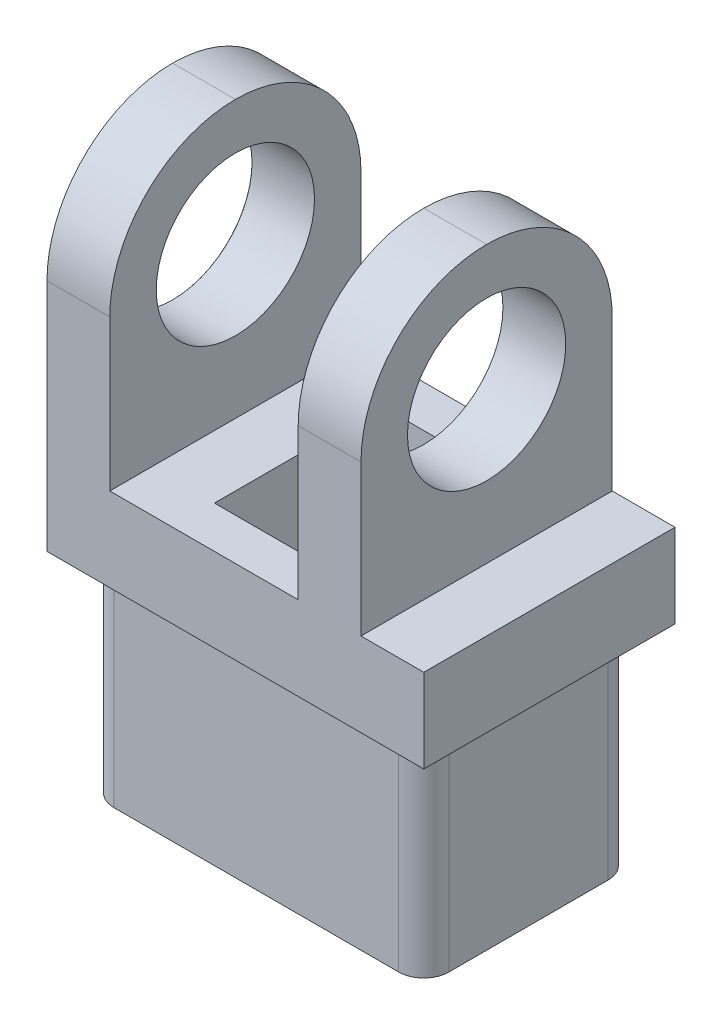
ISO-10303-21;
HEADER;
FILE_DESCRIPTION(('STEP AP214'),'2;1');
FILE_NAME('part.step','',(''),(''),'','','');
FILE_SCHEMA(('AUTOMOTIVE_DESIGN { 1 0 10303 214 1 1 1 1 }'));
ENDSEC;
DATA;
#1=APPLICATION_CONTEXT('core data for automotive mechanical design processes');
#2=APPLICATION_PROTOCOL_DEFINITION('international standard','automotive_design',2000,#1);
#3=PRODUCT_CONTEXT('',#1,'mechanical');
#4=PRODUCT('Part','Part','',(#3));
#5=PRODUCT_RELATED_PRODUCT_CATEGORY('part','',(#4));
#6=PRODUCT_DEFINITION_FORMATION('','',#4);
#7=PRODUCT_DEFINITION_CONTEXT('part definition',#1,'design');
#8=PRODUCT_DEFINITION('design','',#6,#7);
#9=PRODUCT_DEFINITION_SHAPE('','',#8);
#10=(LENGTH_UNIT() NAMED_UNIT(*) SI_UNIT(.MILLI.,.METRE.));
#11=(NAMED_UNIT(*) PLANE_ANGLE_UNIT() SI_UNIT($,.RADIAN.));
#12=(NAMED_UNIT(*) SI_UNIT($,.STERADIAN.) SOLID_ANGLE_UNIT());
#13=UNCERTAINTY_MEASURE_WITH_UNIT(LENGTH_MEASURE(1.E-05),#10,'distance_accuracy_value','');
#14=(GEOMETRIC_REPRESENTATION_CONTEXT(3) GLOBAL_UNCERTAINTY_ASSIGNED_CONTEXT((#13)) GLOBAL_UNIT_ASSIGNED_CONTEXT((#10,
#11,#12)) REPRESENTATION_CONTEXT('',''));
#15=CARTESIAN_POINT('',(0.,0.,0.));
#16=DIRECTION('',(0.,0.,1.));
#17=DIRECTION('',(1.,0.,0.));
#18=AXIS2_PLACEMENT_3D('',#15,#16,#17);
#19=CARTESIAN_POINT('',(0.,0.,0.));
#20=DIRECTION('',(0.,1.,0.));
#21=DIRECTION('',(0.,0.,1.));
#22=AXIS2_PLACEMENT_3D('',#19,#20,#21);
#23=PLANE('',#22);
#24=DIRECTION('',(-1.,0.,0.));
#25=VECTOR('',#24,1.);
#26=CARTESIAN_POINT('',(9.525,0.,-15.875));
#27=LINE('',#26,#25);
#28=CARTESIAN_POINT('',(19.05,0.,-15.875));
#29=VERTEX_POINT('',#28);
#30=CARTESIAN_POINT('',(9.525,0.,-15.875));
#31=VERTEX_POINT('',#30);
#32=EDGE_CURVE('E214',#29,#31,#27,.T.);
#33=ORIENTED_EDGE('',*,*,#32,.F.);
#34=DIRECTION('',(0.,0.,-1.));
#35=VECTOR('',#34,1.);
#36=CARTESIAN_POINT('',(19.05,0.,0.));
#37=LINE('',#36,#35);
#38=CARTESIAN_POINT('',(19.05,0.,-19.05));
#39=VERTEX_POINT('',#38);
#40=EDGE_CURVE('E310',#29,#39,#37,.T.);
#41=ORIENTED_EDGE('',*,*,#40,.T.);
#42=DIRECTION('',(1.,0.,0.));
#43=VECTOR('',#42,1.);
#44=CARTESIAN_POINT('',(0.,0.,-19.05));
#45=LINE('',#44,#43);
#46=CARTESIAN_POINT('',(4.7625,0.,-19.05));
#47=VERTEX_POINT('',#46);
#48=EDGE_CURVE('E257',#47,#39,#45,.T.);
#49=ORIENTED_EDGE('',*,*,#48,.F.);
#50=DIRECTION('',(0.,0.,1.));
#51=VECTOR('',#50,1.);
#52=CARTESIAN_POINT('',(4.7625,0.,0.));
#53=LINE('',#52,#51);
#54=CARTESIAN_POINT('',(4.7625,0.,0.));
#55=VERTEX_POINT('',#54);
#56=EDGE_CURVE('E299',#47,#55,#53,.T.);
#57=ORIENTED_EDGE('',*,*,#56,.T.);
#58=DIRECTION('',(1.,0.,0.));
#59=VECTOR('',#58,1.);
#60=CARTESIAN_POINT('',(0.,0.,0.));
#61=LINE('',#60,#59);
#62=CARTESIAN_POINT('',(19.05,0.,0.));
#63=VERTEX_POINT('',#62);
#64=EDGE_CURVE('E261',#55,#63,#61,.T.);
#65=ORIENTED_EDGE('',*,*,#64,.T.);
#66=CARTESIAN_POINT('',(19.05,0.,-3.175));
#67=VERTEX_POINT('',#66);
#68=EDGE_CURVE('E311',#63,#67,#37,.T.);
#69=ORIENTED_EDGE('',*,*,#68,.T.);
#70=DIRECTION('',(1.,0.,0.));
#71=VECTOR('',#70,1.);
#72=CARTESIAN_POINT('',(9.525,0.,-3.175));
#73=LINE('',#72,#71);
#74=CARTESIAN_POINT('',(9.525,0.,-3.175));
#75=VERTEX_POINT('',#74);
#76=EDGE_CURVE('E50',#75,#67,#73,.T.);
#77=ORIENTED_EDGE('',*,*,#76,.F.);
#78=DIRECTION('',(0.,0.,1.));
#79=VECTOR('',#78,1.);
#80=CARTESIAN_POINT('',(9.525,0.,-15.875));
#81=LINE('',#80,#79);
#82=EDGE_CURVE('E202',#31,#75,#81,.T.);
#83=ORIENTED_EDGE('',*,*,#82,.F.);
#84=EDGE_LOOP('',(#33,#41,#49,#57,#65,#69,#77,#83));
#85=FACE_BOUND('',#84,.T.);
#86=ADVANCED_FACE('F35',(#85),#23,.T.);
#87=CARTESIAN_POINT('',(4.7625,20.955,0.));
#88=DIRECTION('',(1.,0.,0.));
#89=DIRECTION('',(0.,0.,-1.));
#90=AXIS2_PLACEMENT_3D('',#87,#88,#89);
#91=PLANE('',#90);
#92=CARTESIAN_POINT('',(4.7625,11.43,-9.525));
#93=DIRECTION('',(1.,0.,0.));
#94=DIRECTION('',(0.,0.,-1.));
#95=AXIS2_PLACEMENT_3D('',#92,#93,#94);
#96=CIRCLE('',#95,5.99999999999999);
#97=CARTESIAN_POINT('',(4.7625,11.43,-15.525));
#98=VERTEX_POINT('',#97);
#99=EDGE_CURVE('E238',#98,#98,#96,.T.);
#100=ORIENTED_EDGE('',*,*,#99,.F.);
#101=EDGE_LOOP('',(#100));
#102=FACE_BOUND('',#101,.T.);
#103=DIRECTION('',(0.,-1.,0.));
#104=VECTOR('',#103,1.);
#105=CARTESIAN_POINT('',(4.7625,20.955,-19.05));
#106=LINE('',#105,#104);
#107=CARTESIAN_POINT('',(4.7625,11.43,-19.05));
#108=VERTEX_POINT('',#107);
#109=EDGE_CURVE('E308',#108,#47,#106,.T.);
#110=ORIENTED_EDGE('',*,*,#109,.F.);
#111=CARTESIAN_POINT('',(4.7625,11.43,-9.525));
#112=DIRECTION('',(1.,0.,0.));
#113=DIRECTION('',(0.,0.,-1.));
#114=AXIS2_PLACEMENT_3D('',#111,#112,#113);
#115=CIRCLE('',#114,9.525);
#116=CARTESIAN_POINT('',(4.7625,20.955,-9.525));
#117=VERTEX_POINT('',#116);
#118=EDGE_CURVE('E327',#108,#117,#115,.T.);
#119=ORIENTED_EDGE('',*,*,#118,.T.);
#120=CARTESIAN_POINT('',(4.7625,11.43,-9.525));
#121=DIRECTION('',(1.,0.,0.));
#122=DIRECTION('',(0.,0.,-1.));
#123=AXIS2_PLACEMENT_3D('',#120,#121,#122);
#124=CIRCLE('',#123,9.525);
#125=CARTESIAN_POINT('',(4.7625,11.43,0.));
#126=VERTEX_POINT('',#125);
#127=EDGE_CURVE('E325',#117,#126,#124,.T.);
#128=ORIENTED_EDGE('',*,*,#127,.T.);
#129=DIRECTION('',(0.,-1.,0.));
#130=VECTOR('',#129,1.);
#131=CARTESIAN_POINT('',(4.7625,20.955,0.));
#132=LINE('',#131,#130);
#133=EDGE_CURVE('E302',#126,#55,#132,.T.);
#134=ORIENTED_EDGE('',*,*,#133,.T.);
#135=ORIENTED_EDGE('',*,*,#56,.F.);
#136=EDGE_LOOP('',(#110,#119,#128,#134,#135));
#137=FACE_BOUND('',#136,.T.);
#138=ADVANCED_FACE('F429',(#102,#137),#91,.T.);
#139=CARTESIAN_POINT('',(0.,20.955,-19.05));
#140=DIRECTION('',(0.,0.,-1.));
#141=DIRECTION('',(-1.,0.,0.));
#142=AXIS2_PLACEMENT_3D('',#139,#140,#141);
#143=PLANE('',#142);
#144=DIRECTION('',(0.,-1.,0.));
#145=VECTOR('',#144,1.);
#146=CARTESIAN_POINT('',(0.,20.955,-19.05));
#147=LINE('',#146,#145);
#148=CARTESIAN_POINT('',(0.,11.43,-19.05));
#149=VERTEX_POINT('',#148);
#150=CARTESIAN_POINT('',(0.,-6.35,-19.05));
#151=VERTEX_POINT('',#150);
#152=EDGE_CURVE('E306',#149,#151,#147,.T.);
#153=ORIENTED_EDGE('',*,*,#152,.F.);
#154=DIRECTION('',(1.,0.,0.));
#155=VECTOR('',#154,1.);
#156=CARTESIAN_POINT('',(0.,11.43,-19.05));
#157=LINE('',#156,#155);
#158=EDGE_CURVE('E322',#149,#108,#157,.T.);
#159=ORIENTED_EDGE('',*,*,#158,.T.);
#160=ORIENTED_EDGE('',*,*,#109,.T.);
#161=ORIENTED_EDGE('',*,*,#48,.T.);
#162=DIRECTION('',(0.,-1.,0.));
#163=VECTOR('',#162,1.);
#164=CARTESIAN_POINT('',(19.05,20.955,-19.05));
#165=LINE('',#164,#163);
#166=CARTESIAN_POINT('',(19.05,11.43,-19.05));
#167=VERTEX_POINT('',#166);
#168=EDGE_CURVE('E282',#167,#39,#165,.T.);
#169=ORIENTED_EDGE('',*,*,#168,.F.);
#170=DIRECTION('',(1.,0.,0.));
#171=VECTOR('',#170,1.);
#172=CARTESIAN_POINT('',(0.,11.43,-19.05));
#173=LINE('',#172,#171);
#174=CARTESIAN_POINT('',(23.8125,11.43,-19.05));
#175=VERTEX_POINT('',#174);
#176=EDGE_CURVE('E320',#167,#175,#173,.T.);
#177=ORIENTED_EDGE('',*,*,#176,.T.);
#178=DIRECTION('',(0.,-1.,0.));
#179=VECTOR('',#178,1.);
#180=CARTESIAN_POINT('',(23.8125,20.955,-19.05));
#181=LINE('',#180,#179);
#182=CARTESIAN_POINT('',(23.8125,0.,-19.05));
#183=VERTEX_POINT('',#182);
#184=EDGE_CURVE('E285',#175,#183,#181,.T.);
#185=ORIENTED_EDGE('',*,*,#184,.T.);
#186=CARTESIAN_POINT('',(28.575,0.,-19.05));
#187=VERTEX_POINT('',#186);
#188=EDGE_CURVE('E255',#183,#187,#45,.T.);
#189=ORIENTED_EDGE('',*,*,#188,.T.);
#190=DIRECTION('',(0.,1.,0.));
#191=VECTOR('',#190,1.);
#192=CARTESIAN_POINT('',(28.575,-6.35,-19.05));
#193=LINE('',#192,#191);
#194=CARTESIAN_POINT('',(28.575,-6.35,-19.05));
#195=VERTEX_POINT('',#194);
#196=EDGE_CURVE('E264',#195,#187,#193,.T.);
#197=ORIENTED_EDGE('',*,*,#196,.F.);
#198=DIRECTION('',(1.,0.,0.));
#199=VECTOR('',#198,1.);
#200=CARTESIAN_POINT('',(0.,-6.35,-19.05));
#201=LINE('',#200,#199);
#202=EDGE_CURVE('E242',#151,#195,#201,.T.);
#203=ORIENTED_EDGE('',*,*,#202,.F.);
#204=EDGE_LOOP('',(#153,#159,#160,#161,#169,#177,#185,#189,#197,#203));
#205=FACE_BOUND('',#204,.T.);
#206=ADVANCED_FACE('F436',(#205),#143,.T.);
#207=CARTESIAN_POINT('',(0.,20.955,0.));
#208=DIRECTION('',(-1.,0.,0.));
#209=DIRECTION('',(0.,0.,1.));
#210=AXIS2_PLACEMENT_3D('',#207,#208,#209);
#211=PLANE('',#210);
#212=CARTESIAN_POINT('',(0.,11.43,-9.525));
#213=DIRECTION('',(-1.,0.,0.));
#214=DIRECTION('',(0.,0.,1.));
#215=AXIS2_PLACEMENT_3D('',#212,#213,#214);
#216=CIRCLE('',#215,6.025);
#217=CARTESIAN_POINT('',(0.,11.43,-3.5));
#218=VERTEX_POINT('',#217);
#219=EDGE_CURVE('E225',#218,#218,#216,.T.);
#220=ORIENTED_EDGE('',*,*,#219,.F.);
#221=EDGE_LOOP('',(#220));
#222=FACE_BOUND('',#221,.T.);
#223=CARTESIAN_POINT('',(0.,11.43,-9.525));
#224=DIRECTION('',(-1.,0.,0.));
#225=DIRECTION('',(0.,0.,1.));
#226=AXIS2_PLACEMENT_3D('',#223,#224,#225);
#227=CIRCLE('',#226,9.525);
#228=CARTESIAN_POINT('',(0.,11.43,0.));
#229=VERTEX_POINT('',#228);
#230=CARTESIAN_POINT('',(0.,20.955,-9.525));
#231=VERTEX_POINT('',#230);
#232=EDGE_CURVE('E329',#229,#231,#227,.T.);
#233=ORIENTED_EDGE('',*,*,#232,.T.);
#234=CARTESIAN_POINT('',(0.,11.43,-9.525));
#235=DIRECTION('',(-1.,0.,0.));
#236=DIRECTION('',(0.,0.,1.));
#237=AXIS2_PLACEMENT_3D('',#234,#235,#236);
#238=CIRCLE('',#237,9.525);
#239=EDGE_CURVE('E331',#231,#149,#238,.T.);
#240=ORIENTED_EDGE('',*,*,#239,.T.);
#241=ORIENTED_EDGE('',*,*,#152,.T.);
#242=DIRECTION('',(0.,0.,-1.));
#243=VECTOR('',#242,1.);
#244=CARTESIAN_POINT('',(0.,-6.35,0.));
#245=LINE('',#244,#243);
#246=CARTESIAN_POINT('',(0.,-6.35,0.));
#247=VERTEX_POINT('',#246);
#248=EDGE_CURVE('E244',#247,#151,#245,.T.);
#249=ORIENTED_EDGE('',*,*,#248,.F.);
#250=DIRECTION('',(0.,-1.,0.));
#251=VECTOR('',#250,1.);
#252=CARTESIAN_POINT('',(0.,20.955,0.));
#253=LINE('',#252,#251);
#254=EDGE_CURVE('E304',#229,#247,#253,.T.);
#255=ORIENTED_EDGE('',*,*,#254,.F.);
#256=EDGE_LOOP('',(#233,#240,#241,#249,#255));
#257=FACE_BOUND('',#256,.T.);
#258=ADVANCED_FACE('F453',(#222,#257),#211,.T.);
#259=CARTESIAN_POINT('',(0.,20.955,0.));
#260=DIRECTION('',(0.,0.,-1.));
#261=DIRECTION('',(-1.,0.,0.));
#262=AXIS2_PLACEMENT_3D('',#259,#260,#261);
#263=PLANE('',#262);
#264=ORIENTED_EDGE('',*,*,#133,.F.);
#265=DIRECTION('',(1.,0.,0.));
#266=VECTOR('',#265,1.);
#267=CARTESIAN_POINT('',(0.,11.43,0.));
#268=LINE('',#267,#266);
#269=EDGE_CURVE('E336',#126,#229,#268,.F.);
#270=ORIENTED_EDGE('',*,*,#269,.T.);
#271=ORIENTED_EDGE('',*,*,#254,.T.);
#272=DIRECTION('',(1.,0.,0.));
#273=VECTOR('',#272,1.);
#274=CARTESIAN_POINT('',(0.,-6.35,0.));
#275=LINE('',#274,#273);
#276=CARTESIAN_POINT('',(28.575,-6.35,0.));
#277=VERTEX_POINT('',#276);
#278=EDGE_CURVE('E248',#247,#277,#275,.T.);
#279=ORIENTED_EDGE('',*,*,#278,.T.);
#280=DIRECTION('',(0.,1.,0.));
#281=VECTOR('',#280,1.);
#282=CARTESIAN_POINT('',(28.575,-6.35,0.));
#283=LINE('',#282,#281);
#284=CARTESIAN_POINT('',(28.575,0.,0.));
#285=VERTEX_POINT('',#284);
#286=EDGE_CURVE('E254',#277,#285,#283,.T.);
#287=ORIENTED_EDGE('',*,*,#286,.T.);
#288=CARTESIAN_POINT('',(23.8125,0.,0.));
#289=VERTEX_POINT('',#288);
#290=EDGE_CURVE('E259',#289,#285,#61,.T.);
#291=ORIENTED_EDGE('',*,*,#290,.F.);
#292=DIRECTION('',(0.,-1.,0.));
#293=VECTOR('',#292,1.);
#294=CARTESIAN_POINT('',(23.8125,20.955,0.));
#295=LINE('',#294,#293);
#296=CARTESIAN_POINT('',(23.8125,11.43,0.));
#297=VERTEX_POINT('',#296);
#298=EDGE_CURVE('E278',#297,#289,#295,.T.);
#299=ORIENTED_EDGE('',*,*,#298,.F.);
#300=DIRECTION('',(1.,0.,0.));
#301=VECTOR('',#300,1.);
#302=CARTESIAN_POINT('',(19.05,11.43,0.));
#303=LINE('',#302,#301);
#304=CARTESIAN_POINT('',(19.05,11.43,0.));
#305=VERTEX_POINT('',#304);
#306=EDGE_CURVE('E333',#297,#305,#303,.F.);
#307=ORIENTED_EDGE('',*,*,#306,.T.);
#308=DIRECTION('',(0.,-1.,0.));
#309=VECTOR('',#308,1.);
#310=CARTESIAN_POINT('',(19.05,20.955,0.));
#311=LINE('',#310,#309);
#312=EDGE_CURVE('E280',#305,#63,#311,.T.);
#313=ORIENTED_EDGE('',*,*,#312,.T.);
#314=ORIENTED_EDGE('',*,*,#64,.F.);
#315=EDGE_LOOP('',(#264,#270,#271,#279,#287,#291,#299,#307,#313,#314));
#316=FACE_BOUND('',#315,.T.);
#317=ADVANCED_FACE('F444',(#316),#263,.F.);
#318=ORIENTED_EDGE('',*,*,#188,.F.);
#319=DIRECTION('',(0.,0.,-1.));
#320=VECTOR('',#319,1.);
#321=CARTESIAN_POINT('',(23.8125,0.,0.));
#322=LINE('',#321,#320);
#323=EDGE_CURVE('E314',#289,#183,#322,.T.);
#324=ORIENTED_EDGE('',*,*,#323,.F.);
#325=ORIENTED_EDGE('',*,*,#290,.T.);
#326=DIRECTION('',(0.,0.,-1.));
#327=VECTOR('',#326,1.);
#328=CARTESIAN_POINT('',(28.575,0.,0.));
#329=LINE('',#328,#327);
#330=EDGE_CURVE('E245',#285,#187,#329,.T.);
#331=ORIENTED_EDGE('',*,*,#330,.T.);
#332=EDGE_LOOP('',(#318,#324,#325,#331));
#333=FACE_BOUND('',#332,.T.);
#334=ADVANCED_FACE('F432',(#333),#23,.T.);
#335=CARTESIAN_POINT('',(23.8125,20.955,0.));
#336=DIRECTION('',(1.,0.,0.));
#337=DIRECTION('',(0.,0.,-1.));
#338=AXIS2_PLACEMENT_3D('',#335,#336,#337);
#339=PLANE('',#338);
#340=CARTESIAN_POINT('',(23.8125,11.43,-9.525));
#341=DIRECTION('',(1.,0.,0.));
#342=DIRECTION('',(0.,0.,-1.));
#343=AXIS2_PLACEMENT_3D('',#340,#341,#342);
#344=CIRCLE('',#343,5.99999999999999);
#345=CARTESIAN_POINT('',(23.8125,11.43,-15.525));
#346=VERTEX_POINT('',#345);
#347=EDGE_CURVE('E234',#346,#346,#344,.T.);
#348=ORIENTED_EDGE('',*,*,#347,.F.);
#349=EDGE_LOOP('',(#348));
#350=FACE_BOUND('',#349,.T.);
#351=CARTESIAN_POINT('',(23.8125,11.43,-9.525));
#352=DIRECTION('',(1.,0.,0.));
#353=DIRECTION('',(0.,0.,-1.));
#354=AXIS2_PLACEMENT_3D('',#351,#352,#353);
#355=CIRCLE('',#354,9.525);
#356=CARTESIAN_POINT('',(23.8125,20.955,-9.525));
#357=VERTEX_POINT('',#356);
#358=EDGE_CURVE('E338',#175,#357,#355,.T.);
#359=ORIENTED_EDGE('',*,*,#358,.T.);
#360=CARTESIAN_POINT('',(23.8125,11.43,-9.525));
#361=DIRECTION('',(1.,0.,0.));
#362=DIRECTION('',(0.,0.,-1.));
#363=AXIS2_PLACEMENT_3D('',#360,#361,#362);
#364=CIRCLE('',#363,9.525);
#365=EDGE_CURVE('E340',#357,#297,#364,.T.);
#366=ORIENTED_EDGE('',*,*,#365,.T.);
#367=ORIENTED_EDGE('',*,*,#298,.T.);
#368=ORIENTED_EDGE('',*,*,#323,.T.);
#369=ORIENTED_EDGE('',*,*,#184,.F.);
#370=EDGE_LOOP('',(#359,#366,#367,#368,#369));
#371=FACE_BOUND('',#370,.T.);
#372=ADVANCED_FACE('F443',(#350,#371),#339,.T.);
#373=CARTESIAN_POINT('',(19.05,20.955,0.));
#374=DIRECTION('',(1.,0.,0.));
#375=DIRECTION('',(0.,0.,-1.));
#376=AXIS2_PLACEMENT_3D('',#373,#374,#375);
#377=PLANE('',#376);
#378=CARTESIAN_POINT('',(19.05,11.43,-9.525));
#379=DIRECTION('',(1.,0.,0.));
#380=DIRECTION('',(0.,0.,-1.));
#381=AXIS2_PLACEMENT_3D('',#378,#379,#380);
#382=CIRCLE('',#381,5.99999999999999);
#383=CARTESIAN_POINT('',(19.05,11.43,-15.525));
#384=VERTEX_POINT('',#383);
#385=EDGE_CURVE('E235',#384,#384,#382,.T.);
#386=ORIENTED_EDGE('',*,*,#385,.T.);
#387=EDGE_LOOP('',(#386));
#388=FACE_BOUND('',#387,.T.);
#389=ORIENTED_EDGE('',*,*,#312,.F.);
#390=CARTESIAN_POINT('',(19.05,11.43,-9.525));
#391=DIRECTION('',(1.,0.,0.));
#392=DIRECTION('',(0.,0.,-1.));
#393=AXIS2_PLACEMENT_3D('',#390,#391,#392);
#394=CIRCLE('',#393,9.525);
#395=CARTESIAN_POINT('',(19.05,20.955,-9.525));
#396=VERTEX_POINT('',#395);
#397=EDGE_CURVE('E344',#305,#396,#394,.F.);
#398=ORIENTED_EDGE('',*,*,#397,.T.);
#399=CARTESIAN_POINT('',(19.05,11.43,-9.525));
#400=DIRECTION('',(1.,0.,0.));
#401=DIRECTION('',(0.,0.,-1.));
#402=AXIS2_PLACEMENT_3D('',#399,#400,#401);
#403=CIRCLE('',#402,9.525);
#404=EDGE_CURVE('E342',#396,#167,#403,.F.);
#405=ORIENTED_EDGE('',*,*,#404,.T.);
#406=ORIENTED_EDGE('',*,*,#168,.T.);
#407=ORIENTED_EDGE('',*,*,#40,.F.);
#408=DIRECTION('',(0.,1.,0.));
#409=VECTOR('',#408,1.);
#410=CARTESIAN_POINT('',(19.05,-22.225,-15.875));
#411=LINE('',#410,#409);
#412=CARTESIAN_POINT('',(19.05,-22.225,-15.875));
#413=VERTEX_POINT('',#412);
#414=EDGE_CURVE('E226',#413,#29,#411,.T.);
#415=ORIENTED_EDGE('',*,*,#414,.F.);
#416=DIRECTION('',(0.,0.,-1.));
#417=VECTOR('',#416,1.);
#418=CARTESIAN_POINT('',(19.05,-22.225,-15.875));
#419=LINE('',#418,#417);
#420=CARTESIAN_POINT('',(19.05,-22.225,-3.175));
#421=VERTEX_POINT('',#420);
#422=EDGE_CURVE('E57',#421,#413,#419,.T.);
#423=ORIENTED_EDGE('',*,*,#422,.F.);
#424=DIRECTION('',(0.,1.,0.));
#425=VECTOR('',#424,1.);
#426=CARTESIAN_POINT('',(19.05,-22.225,-3.175));
#427=LINE('',#426,#425);
#428=EDGE_CURVE('E203',#421,#67,#427,.T.);
#429=ORIENTED_EDGE('',*,*,#428,.T.);
#430=ORIENTED_EDGE('',*,*,#68,.F.);
#431=EDGE_LOOP('',(#389,#398,#405,#406,#407,#415,#423,#429,#430));
#432=FACE_BOUND('',#431,.T.);
#433=ADVANCED_FACE('F450',(#388,#432),#377,.F.);
#434=CARTESIAN_POINT('',(28.575,-6.35,0.));
#435=DIRECTION('',(1.,0.,0.));
#436=DIRECTION('',(0.,0.,-1.));
#437=AXIS2_PLACEMENT_3D('',#434,#435,#436);
#438=PLANE('',#437);
#439=ORIENTED_EDGE('',*,*,#330,.F.);
#440=ORIENTED_EDGE('',*,*,#286,.F.);
#441=DIRECTION('',(0.,0.,-1.));
#442=VECTOR('',#441,1.);
#443=CARTESIAN_POINT('',(28.575,-6.35,0.));
#444=LINE('',#443,#442);
#445=EDGE_CURVE('E251',#277,#195,#444,.T.);
#446=ORIENTED_EDGE('',*,*,#445,.T.);
#447=ORIENTED_EDGE('',*,*,#196,.T.);
#448=EDGE_LOOP('',(#439,#440,#446,#447));
#449=FACE_BOUND('',#448,.T.);
#450=ADVANCED_FACE('F466',(#449),#438,.T.);
#451=CARTESIAN_POINT('',(0.,-6.35,0.));
#452=DIRECTION('',(0.,1.,0.));
#453=DIRECTION('',(0.,0.,1.));
#454=AXIS2_PLACEMENT_3D('',#451,#452,#453);
#455=PLANE('',#454);
#456=DIRECTION('',(0.,0.,-1.));
#457=VECTOR('',#456,1.);
#458=CARTESIAN_POINT('',(1.5875,-6.35,-17.4625));
#459=LINE('',#458,#457);
#460=CARTESIAN_POINT('',(1.5875,-6.35,-3.4925));
#461=VERTEX_POINT('',#460);
#462=CARTESIAN_POINT('',(1.5875,-6.35,-15.5575));
#463=VERTEX_POINT('',#462);
#464=EDGE_CURVE('E275',#461,#463,#459,.T.);
#465=ORIENTED_EDGE('',*,*,#464,.F.);
#466=CARTESIAN_POINT('',(3.4925,-6.35,-3.4925));
#467=DIRECTION('',(0.,1.,0.));
#468=DIRECTION('',(0.,0.,1.));
#469=AXIS2_PLACEMENT_3D('',#466,#467,#468);
#470=CIRCLE('',#469,1.905);
#471=CARTESIAN_POINT('',(3.4925,-6.35,-1.5875));
#472=VERTEX_POINT('',#471);
#473=EDGE_CURVE('E382',#461,#472,#470,.T.);
#474=ORIENTED_EDGE('',*,*,#473,.T.);
#475=DIRECTION('',(-1.,0.,0.));
#476=VECTOR('',#475,1.);
#477=CARTESIAN_POINT('',(1.5875,-6.35,-1.5875));
#478=LINE('',#477,#476);
#479=CARTESIAN_POINT('',(25.0825,-6.35,-1.5875));
#480=VERTEX_POINT('',#479);
#481=EDGE_CURVE('E317',#480,#472,#478,.T.);
#482=ORIENTED_EDGE('',*,*,#481,.F.);
#483=CARTESIAN_POINT('',(25.0825,-6.35,-3.4925));
#484=DIRECTION('',(0.,1.,0.));
#485=DIRECTION('',(0.,0.,1.));
#486=AXIS2_PLACEMENT_3D('',#483,#484,#485);
#487=CIRCLE('',#486,1.905);
#488=CARTESIAN_POINT('',(26.9875,-6.35,-3.4925));
#489=VERTEX_POINT('',#488);
#490=EDGE_CURVE('E43',#480,#489,#487,.T.);
#491=ORIENTED_EDGE('',*,*,#490,.T.);
#492=DIRECTION('',(0.,0.,1.));
#493=VECTOR('',#492,1.);
#494=CARTESIAN_POINT('',(26.9875,-6.35,-17.4625));
#495=LINE('',#494,#493);
#496=CARTESIAN_POINT('',(26.9875,-6.35,-15.5575));
#497=VERTEX_POINT('',#496);
#498=EDGE_CURVE('E267',#497,#489,#495,.T.);
#499=ORIENTED_EDGE('',*,*,#498,.F.);
#500=CARTESIAN_POINT('',(25.0825,-6.35,-15.5575));
#501=DIRECTION('',(0.,1.,0.));
#502=DIRECTION('',(0.,0.,1.));
#503=AXIS2_PLACEMENT_3D('',#500,#501,#502);
#504=CIRCLE('',#503,1.905);
#505=CARTESIAN_POINT('',(25.0825,-6.35,-17.4625));
#506=VERTEX_POINT('',#505);
#507=EDGE_CURVE('E11',#497,#506,#504,.T.);
#508=ORIENTED_EDGE('',*,*,#507,.T.);
#509=DIRECTION('',(1.,0.,0.));
#510=VECTOR('',#509,1.);
#511=CARTESIAN_POINT('',(1.5875,-6.35,-17.4625));
#512=LINE('',#511,#510);
#513=CARTESIAN_POINT('',(3.4925,-6.35,-17.4625));
#514=VERTEX_POINT('',#513);
#515=EDGE_CURVE('E272',#514,#506,#512,.T.);
#516=ORIENTED_EDGE('',*,*,#515,.F.);
#517=CARTESIAN_POINT('',(3.4925,-6.35,-15.5575));
#518=DIRECTION('',(0.,1.,0.));
#519=DIRECTION('',(0.,0.,1.));
#520=AXIS2_PLACEMENT_3D('',#517,#518,#519);
#521=CIRCLE('',#520,1.905);
#522=EDGE_CURVE('E380',#514,#463,#521,.T.);
#523=ORIENTED_EDGE('',*,*,#522,.T.);
#524=EDGE_LOOP('',(#465,#474,#482,#491,#499,#508,#516,#523));
#525=FACE_BOUND('',#524,.T.);
#526=ORIENTED_EDGE('',*,*,#202,.T.);
#527=ORIENTED_EDGE('',*,*,#445,.F.);
#528=ORIENTED_EDGE('',*,*,#278,.F.);
#529=ORIENTED_EDGE('',*,*,#248,.T.);
#530=EDGE_LOOP('',(#526,#527,#528,#529));
#531=FACE_BOUND('',#530,.T.);
#532=ADVANCED_FACE('F387',(#525,#531),#455,.F.);
#533=CARTESIAN_POINT('',(0.,-22.225,0.));
#534=DIRECTION('',(0.,1.,0.));
#535=DIRECTION('',(0.,0.,1.));
#536=AXIS2_PLACEMENT_3D('',#533,#534,#535);
#537=PLANE('',#536);
#538=DIRECTION('',(-1.,0.,0.));
#539=VECTOR('',#538,1.);
#540=CARTESIAN_POINT('',(9.525,-22.225,-15.875));
#541=LINE('',#540,#539);
#542=CARTESIAN_POINT('',(9.525,-22.225,-15.875));
#543=VERTEX_POINT('',#542);
#544=EDGE_CURVE('E204',#413,#543,#541,.T.);
#545=ORIENTED_EDGE('',*,*,#544,.T.);
#546=DIRECTION('',(0.,0.,1.));
#547=VECTOR('',#546,1.);
#548=CARTESIAN_POINT('',(9.525,-22.225,-15.875));
#549=LINE('',#548,#547);
#550=CARTESIAN_POINT('',(9.525,-22.225,-3.175));
#551=VERTEX_POINT('',#550);
#552=EDGE_CURVE('E199',#543,#551,#549,.T.);
#553=ORIENTED_EDGE('',*,*,#552,.T.);
#554=DIRECTION('',(1.,0.,0.));
#555=VECTOR('',#554,1.);
#556=CARTESIAN_POINT('',(9.525,-22.225,-3.175));
#557=LINE('',#556,#555);
#558=EDGE_CURVE('E207',#551,#421,#557,.T.);
#559=ORIENTED_EDGE('',*,*,#558,.T.);
#560=ORIENTED_EDGE('',*,*,#422,.T.);
#561=EDGE_LOOP('',(#545,#553,#559,#560));
#562=FACE_BOUND('',#561,.T.);
#563=DIRECTION('',(0.,0.,1.));
#564=VECTOR('',#563,1.);
#565=CARTESIAN_POINT('',(1.5875,-22.225,-17.4625));
#566=LINE('',#565,#564);
#567=CARTESIAN_POINT('',(1.5875,-22.225,-15.5575));
#568=VERTEX_POINT('',#567);
#569=CARTESIAN_POINT('',(1.5875,-22.225,-3.4925));
#570=VERTEX_POINT('',#569);
#571=EDGE_CURVE('E287',#568,#570,#566,.T.);
#572=ORIENTED_EDGE('',*,*,#571,.F.);
#573=CARTESIAN_POINT('',(3.4925,-22.225,-15.5575));
#574=DIRECTION('',(0.,1.,0.));
#575=DIRECTION('',(0.,0.,1.));
#576=AXIS2_PLACEMENT_3D('',#573,#574,#575);
#577=CIRCLE('',#576,1.905);
#578=CARTESIAN_POINT('',(3.4925,-22.225,-17.4625));
#579=VERTEX_POINT('',#578);
#580=EDGE_CURVE('E368',#568,#579,#577,.F.);
#581=ORIENTED_EDGE('',*,*,#580,.T.);
#582=DIRECTION('',(-1.,0.,0.));
#583=VECTOR('',#582,1.);
#584=CARTESIAN_POINT('',(1.5875,-22.225,-17.4625));
#585=LINE('',#584,#583);
#586=CARTESIAN_POINT('',(25.0825,-22.225,-17.4625));
#587=VERTEX_POINT('',#586);
#588=EDGE_CURVE('E296',#587,#579,#585,.T.);
#589=ORIENTED_EDGE('',*,*,#588,.F.);
#590=CARTESIAN_POINT('',(25.0825,-22.225,-15.5575));
#591=DIRECTION('',(0.,1.,0.));
#592=DIRECTION('',(0.,0.,1.));
#593=AXIS2_PLACEMENT_3D('',#590,#591,#592);
#594=CIRCLE('',#593,1.905);
#595=CARTESIAN_POINT('',(26.9875,-22.225,-15.5575));
#596=VERTEX_POINT('',#595);
#597=EDGE_CURVE('E362',#587,#596,#594,.F.);
#598=ORIENTED_EDGE('',*,*,#597,.T.);
#599=DIRECTION('',(0.,0.,-1.));
#600=VECTOR('',#599,1.);
#601=CARTESIAN_POINT('',(26.9875,-22.225,-17.4625));
#602=LINE('',#601,#600);
#603=CARTESIAN_POINT('',(26.9875,-22.225,-3.4925));
#604=VERTEX_POINT('',#603);
#605=EDGE_CURVE('E293',#604,#596,#602,.T.);
#606=ORIENTED_EDGE('',*,*,#605,.F.);
#607=CARTESIAN_POINT('',(25.0825,-22.225,-3.4925));
#608=DIRECTION('',(0.,1.,0.));
#609=DIRECTION('',(0.,0.,1.));
#610=AXIS2_PLACEMENT_3D('',#607,#608,#609);
#611=CIRCLE('',#610,1.905);
#612=CARTESIAN_POINT('',(25.0825,-22.225,-1.5875));
#613=VERTEX_POINT('',#612);
#614=EDGE_CURVE('E364',#604,#613,#611,.F.);
#615=ORIENTED_EDGE('',*,*,#614,.T.);
#616=DIRECTION('',(1.,0.,0.));
#617=VECTOR('',#616,1.);
#618=CARTESIAN_POINT('',(1.5875,-22.225,-1.5875));
#619=LINE('',#618,#617);
#620=CARTESIAN_POINT('',(3.4925,-22.225,-1.5875));
#621=VERTEX_POINT('',#620);
#622=EDGE_CURVE('E290',#621,#613,#619,.T.);
#623=ORIENTED_EDGE('',*,*,#622,.F.);
#624=CARTESIAN_POINT('',(3.4925,-22.225,-3.4925));
#625=DIRECTION('',(0.,1.,0.));
#626=DIRECTION('',(0.,0.,1.));
#627=AXIS2_PLACEMENT_3D('',#624,#625,#626);
#628=CIRCLE('',#627,1.905);
#629=EDGE_CURVE('E366',#621,#570,#628,.F.);
#630=ORIENTED_EDGE('',*,*,#629,.T.);
#631=EDGE_LOOP('',(#572,#581,#589,#598,#606,#615,#623,#630));
#632=FACE_BOUND('',#631,.T.);
#633=ADVANCED_FACE('F211',(#562,#632),#537,.F.);
#634=CARTESIAN_POINT('',(1.5875,-22.225,-1.5875));
#635=DIRECTION('',(0.,0.,1.));
#636=DIRECTION('',(1.,0.,0.));
#637=AXIS2_PLACEMENT_3D('',#634,#635,#636);
#638=PLANE('',#637);
#639=ORIENTED_EDGE('',*,*,#481,.T.);
#640=DIRECTION('',(0.,1.,0.));
#641=VECTOR('',#640,1.);
#642=CARTESIAN_POINT('',(3.4925,-22.225,-1.5875));
#643=LINE('',#642,#641);
#644=EDGE_CURVE('E373',#472,#621,#643,.F.);
#645=ORIENTED_EDGE('',*,*,#644,.T.);
#646=ORIENTED_EDGE('',*,*,#622,.T.);
#647=DIRECTION('',(0.,1.,0.));
#648=VECTOR('',#647,1.);
#649=CARTESIAN_POINT('',(25.0825,-22.225,-1.5875));
#650=LINE('',#649,#648);
#651=EDGE_CURVE('E370',#613,#480,#650,.T.);
#652=ORIENTED_EDGE('',*,*,#651,.T.);
#653=EDGE_LOOP('',(#639,#645,#646,#652));
#654=FACE_BOUND('',#653,.T.);
#655=ADVANCED_FACE('F402',(#654),#638,.T.);
#656=CARTESIAN_POINT('',(26.9875,-22.225,-17.4625));
#657=DIRECTION('',(1.,0.,0.));
#658=DIRECTION('',(0.,0.,-1.));
#659=AXIS2_PLACEMENT_3D('',#656,#657,#658);
#660=PLANE('',#659);
#661=ORIENTED_EDGE('',*,*,#498,.T.);
#662=DIRECTION('',(0.,1.,0.));
#663=VECTOR('',#662,1.);
#664=CARTESIAN_POINT('',(26.9875,-22.225,-3.4925));
#665=LINE('',#664,#663);
#666=EDGE_CURVE('E378',#489,#604,#665,.F.);
#667=ORIENTED_EDGE('',*,*,#666,.T.);
#668=ORIENTED_EDGE('',*,*,#605,.T.);
#669=DIRECTION('',(0.,1.,0.));
#670=VECTOR('',#669,1.);
#671=CARTESIAN_POINT('',(26.9875,-22.225,-15.5575));
#672=LINE('',#671,#670);
#673=EDGE_CURVE('E375',#596,#497,#672,.T.);
#674=ORIENTED_EDGE('',*,*,#673,.T.);
#675=EDGE_LOOP('',(#661,#667,#668,#674));
#676=FACE_BOUND('',#675,.T.);
#677=ADVANCED_FACE('F393',(#676),#660,.T.);
#678=CARTESIAN_POINT('',(1.5875,-22.225,-17.4625));
#679=DIRECTION('',(0.,0.,-1.));
#680=DIRECTION('',(-1.,0.,0.));
#681=AXIS2_PLACEMENT_3D('',#678,#679,#680);
#682=PLANE('',#681);
#683=ORIENTED_EDGE('',*,*,#588,.T.);
#684=DIRECTION('',(0.,1.,0.));
#685=VECTOR('',#684,1.);
#686=CARTESIAN_POINT('',(3.4925,-22.225,-17.4625));
#687=LINE('',#686,#685);
#688=EDGE_CURVE('E354',#579,#514,#687,.T.);
#689=ORIENTED_EDGE('',*,*,#688,.T.);
#690=ORIENTED_EDGE('',*,*,#515,.T.);
#691=DIRECTION('',(0.,1.,0.));
#692=VECTOR('',#691,1.);
#693=CARTESIAN_POINT('',(25.0825,-22.225,-17.4625));
#694=LINE('',#693,#692);
#695=EDGE_CURVE('E346',#506,#587,#694,.F.);
#696=ORIENTED_EDGE('',*,*,#695,.T.);
#697=EDGE_LOOP('',(#683,#689,#690,#696));
#698=FACE_BOUND('',#697,.T.);
#699=ADVANCED_FACE('F417',(#698),#682,.T.);
#700=CARTESIAN_POINT('',(1.5875,-22.225,-17.4625));
#701=DIRECTION('',(-1.,0.,0.));
#702=DIRECTION('',(0.,0.,1.));
#703=AXIS2_PLACEMENT_3D('',#700,#701,#702);
#704=PLANE('',#703);
#705=ORIENTED_EDGE('',*,*,#464,.T.);
#706=DIRECTION('',(0.,1.,0.));
#707=VECTOR('',#706,1.);
#708=CARTESIAN_POINT('',(1.5875,-22.225,-15.5575));
#709=LINE('',#708,#707);
#710=EDGE_CURVE('E360',#463,#568,#709,.F.);
#711=ORIENTED_EDGE('',*,*,#710,.T.);
#712=ORIENTED_EDGE('',*,*,#571,.T.);
#713=DIRECTION('',(0.,1.,0.));
#714=VECTOR('',#713,1.);
#715=CARTESIAN_POINT('',(1.5875,-22.225,-3.4925));
#716=LINE('',#715,#714);
#717=EDGE_CURVE('E357',#570,#461,#716,.T.);
#718=ORIENTED_EDGE('',*,*,#717,.T.);
#719=EDGE_LOOP('',(#705,#711,#712,#718));
#720=FACE_BOUND('',#719,.T.);
#721=ADVANCED_FACE('F409',(#720),#704,.T.);
#722=CARTESIAN_POINT('',(0.,11.43,-9.525));
#723=DIRECTION('',(-1.,0.,0.));
#724=DIRECTION('',(0.,0.,1.));
#725=AXIS2_PLACEMENT_3D('',#722,#723,#724);
#726=CYLINDRICAL_SURFACE('',#725,9.525);
#727=DIRECTION('',(1.,0.,0.));
#728=VECTOR('',#727,1.);
#729=CARTESIAN_POINT('',(4.7625,20.955,-9.525));
#730=LINE('',#729,#728);
#731=EDGE_CURVE('E258',#231,#117,#730,.T.);
#732=ORIENTED_EDGE('',*,*,#731,.F.);
#733=ORIENTED_EDGE('',*,*,#232,.F.);
#734=ORIENTED_EDGE('',*,*,#269,.F.);
#735=ORIENTED_EDGE('',*,*,#127,.F.);
#736=EDGE_LOOP('',(#732,#733,#734,#735));
#737=FACE_BOUND('',#736,.T.);
#738=ADVANCED_FACE('F483',(#737),#726,.T.);
#739=CARTESIAN_POINT('',(0.,11.43,-9.525));
#740=DIRECTION('',(1.,0.,0.));
#741=DIRECTION('',(0.,0.,-1.));
#742=AXIS2_PLACEMENT_3D('',#739,#740,#741);
#743=CYLINDRICAL_SURFACE('',#742,9.525);
#744=ORIENTED_EDGE('',*,*,#239,.F.);
#745=ORIENTED_EDGE('',*,*,#731,.T.);
#746=ORIENTED_EDGE('',*,*,#118,.F.);
#747=ORIENTED_EDGE('',*,*,#158,.F.);
#748=EDGE_LOOP('',(#744,#745,#746,#747));
#749=FACE_BOUND('',#748,.T.);
#750=ADVANCED_FACE('F475',(#749),#743,.T.);
#751=CARTESIAN_POINT('',(0.,11.43,-9.525));
#752=DIRECTION('',(1.,0.,0.));
#753=DIRECTION('',(0.,0.,-1.));
#754=AXIS2_PLACEMENT_3D('',#751,#752,#753);
#755=CYLINDRICAL_SURFACE('',#754,9.525);
#756=ORIENTED_EDGE('',*,*,#176,.F.);
#757=ORIENTED_EDGE('',*,*,#404,.F.);
#758=DIRECTION('',(1.,0.,0.));
#759=VECTOR('',#758,1.);
#760=CARTESIAN_POINT('',(0.,20.955,-9.525));
#761=LINE('',#760,#759);
#762=EDGE_CURVE('E241',#357,#396,#761,.F.);
#763=ORIENTED_EDGE('',*,*,#762,.F.);
#764=ORIENTED_EDGE('',*,*,#358,.F.);
#765=EDGE_LOOP('',(#756,#757,#763,#764));
#766=FACE_BOUND('',#765,.T.);
#767=ADVANCED_FACE('F499',(#766),#755,.T.);
#768=CARTESIAN_POINT('',(0.,11.43,-9.525));
#769=DIRECTION('',(-1.,0.,0.));
#770=DIRECTION('',(0.,0.,1.));
#771=AXIS2_PLACEMENT_3D('',#768,#769,#770);
#772=CYLINDRICAL_SURFACE('',#771,9.525);
#773=ORIENTED_EDGE('',*,*,#397,.F.);
#774=ORIENTED_EDGE('',*,*,#306,.F.);
#775=ORIENTED_EDGE('',*,*,#365,.F.);
#776=ORIENTED_EDGE('',*,*,#762,.T.);
#777=EDGE_LOOP('',(#773,#774,#775,#776));
#778=FACE_BOUND('',#777,.T.);
#779=ADVANCED_FACE('F502',(#778),#772,.T.);
#780=CARTESIAN_POINT('',(0.,11.43,-9.525));
#781=DIRECTION('',(-1.,0.,0.));
#782=DIRECTION('',(0.,0.,1.));
#783=AXIS2_PLACEMENT_3D('',#780,#781,#782);
#784=CYLINDRICAL_SURFACE('',#783,5.99999999999999);
#785=ORIENTED_EDGE('',*,*,#347,.T.);
#786=EDGE_LOOP('',(#785));
#787=FACE_BOUND('',#786,.T.);
#788=ORIENTED_EDGE('',*,*,#385,.F.);
#789=EDGE_LOOP('',(#788));
#790=FACE_BOUND('',#789,.T.);
#791=ADVANCED_FACE('F505',(#787,#790),#784,.F.);
#792=ORIENTED_EDGE('',*,*,#99,.T.);
#793=EDGE_LOOP('',(#792));
#794=FACE_BOUND('',#793,.T.);
#795=CARTESIAN_POINT('',(0.0250000000000042,11.43,-9.525));
#796=DIRECTION('',(-1.,0.,0.));
#797=DIRECTION('',(0.,0.,1.));
#798=AXIS2_PLACEMENT_3D('',#795,#796,#797);
#799=CIRCLE('',#798,6.);
#800=CARTESIAN_POINT('',(0.0250000000000042,11.43,-3.525));
#801=VERTEX_POINT('',#800);
#802=EDGE_CURVE('E231',#801,#801,#799,.T.);
#803=ORIENTED_EDGE('',*,*,#802,.T.);
#804=EDGE_LOOP('',(#803));
#805=FACE_BOUND('',#804,.T.);
#806=ADVANCED_FACE('F584',(#794,#805),#784,.F.);
#807=CARTESIAN_POINT('',(0.,11.43,-9.525));
#808=DIRECTION('',(-1.,0.,0.));
#809=DIRECTION('',(0.,0.,1.));
#810=AXIS2_PLACEMENT_3D('',#807,#808,#809);
#811=CONICAL_SURFACE('',#810,6.025,0.785398163397431);
#812=ORIENTED_EDGE('',*,*,#802,.F.);
#813=EDGE_LOOP('',(#812));
#814=FACE_BOUND('',#813,.T.);
#815=ORIENTED_EDGE('',*,*,#219,.T.);
#816=EDGE_LOOP('',(#815));
#817=FACE_BOUND('',#816,.T.);
#818=ADVANCED_FACE('F512',(#814,#817),#811,.F.);
#819=CARTESIAN_POINT('',(3.4925,-22.225,-15.5575));
#820=DIRECTION('',(0.,1.,0.));
#821=DIRECTION('',(0.,0.,1.));
#822=AXIS2_PLACEMENT_3D('',#819,#820,#821);
#823=CYLINDRICAL_SURFACE('',#822,1.905);
#824=ORIENTED_EDGE('',*,*,#580,.F.);
#825=ORIENTED_EDGE('',*,*,#710,.F.);
#826=ORIENTED_EDGE('',*,*,#522,.F.);
#827=ORIENTED_EDGE('',*,*,#688,.F.);
#828=EDGE_LOOP('',(#824,#825,#826,#827));
#829=FACE_BOUND('',#828,.T.);
#830=ADVANCED_FACE('F412',(#829),#823,.T.);
#831=CARTESIAN_POINT('',(3.4925,-22.225,-3.4925));
#832=DIRECTION('',(0.,1.,0.));
#833=DIRECTION('',(0.,0.,1.));
#834=AXIS2_PLACEMENT_3D('',#831,#832,#833);
#835=CYLINDRICAL_SURFACE('',#834,1.905);
#836=ORIENTED_EDGE('',*,*,#629,.F.);
#837=ORIENTED_EDGE('',*,*,#644,.F.);
#838=ORIENTED_EDGE('',*,*,#473,.F.);
#839=ORIENTED_EDGE('',*,*,#717,.F.);
#840=EDGE_LOOP('',(#836,#837,#838,#839));
#841=FACE_BOUND('',#840,.T.);
#842=ADVANCED_FACE('F405',(#841),#835,.T.);
#843=CARTESIAN_POINT('',(25.0825,-22.225,-3.4925));
#844=DIRECTION('',(0.,1.,0.));
#845=DIRECTION('',(0.,0.,1.));
#846=AXIS2_PLACEMENT_3D('',#843,#844,#845);
#847=CYLINDRICAL_SURFACE('',#846,1.905);
#848=ORIENTED_EDGE('',*,*,#614,.F.);
#849=ORIENTED_EDGE('',*,*,#666,.F.);
#850=ORIENTED_EDGE('',*,*,#490,.F.);
#851=ORIENTED_EDGE('',*,*,#651,.F.);
#852=EDGE_LOOP('',(#848,#849,#850,#851));
#853=FACE_BOUND('',#852,.T.);
#854=ADVANCED_FACE('F397',(#853),#847,.T.);
#855=CARTESIAN_POINT('',(25.0825,-22.225,-15.5575));
#856=DIRECTION('',(0.,1.,0.));
#857=DIRECTION('',(0.,0.,1.));
#858=AXIS2_PLACEMENT_3D('',#855,#856,#857);
#859=CYLINDRICAL_SURFACE('',#858,1.905);
#860=ORIENTED_EDGE('',*,*,#597,.F.);
#861=ORIENTED_EDGE('',*,*,#695,.F.);
#862=ORIENTED_EDGE('',*,*,#507,.F.);
#863=ORIENTED_EDGE('',*,*,#673,.F.);
#864=EDGE_LOOP('',(#860,#861,#862,#863));
#865=FACE_BOUND('',#864,.T.);
#866=ADVANCED_FACE('F37',(#865),#859,.T.);
#867=CARTESIAN_POINT('',(9.525,-22.225,-15.875));
#868=DIRECTION('',(-1.,0.,0.));
#869=DIRECTION('',(0.,0.,1.));
#870=AXIS2_PLACEMENT_3D('',#867,#868,#869);
#871=PLANE('',#870);
#872=ORIENTED_EDGE('',*,*,#82,.T.);
#873=DIRECTION('',(0.,1.,0.));
#874=VECTOR('',#873,1.);
#875=CARTESIAN_POINT('',(9.525,-22.225,-3.175));
#876=LINE('',#875,#874);
#877=EDGE_CURVE('E195',#551,#75,#876,.T.);
#878=ORIENTED_EDGE('',*,*,#877,.F.);
#879=ORIENTED_EDGE('',*,*,#552,.F.);
#880=DIRECTION('',(0.,1.,0.));
#881=VECTOR('',#880,1.);
#882=CARTESIAN_POINT('',(9.525,-22.225,-15.875));
#883=LINE('',#882,#881);
#884=EDGE_CURVE('E223',#543,#31,#883,.T.);
#885=ORIENTED_EDGE('',*,*,#884,.T.);
#886=EDGE_LOOP('',(#872,#878,#879,#885));
#887=FACE_BOUND('',#886,.T.);
#888=ADVANCED_FACE('F197',(#887),#871,.F.);
#889=CARTESIAN_POINT('',(9.525,-22.225,-15.875));
#890=DIRECTION('',(0.,0.,-1.));
#891=DIRECTION('',(-1.,0.,0.));
#892=AXIS2_PLACEMENT_3D('',#889,#890,#891);
#893=PLANE('',#892);
#894=ORIENTED_EDGE('',*,*,#32,.T.);
#895=ORIENTED_EDGE('',*,*,#884,.F.);
#896=ORIENTED_EDGE('',*,*,#544,.F.);
#897=ORIENTED_EDGE('',*,*,#414,.T.);
#898=EDGE_LOOP('',(#894,#895,#896,#897));
#899=FACE_BOUND('',#898,.T.);
#900=ADVANCED_FACE('F426',(#899),#893,.F.);
#901=CARTESIAN_POINT('',(9.525,-22.225,-3.175));
#902=DIRECTION('',(0.,0.,1.));
#903=DIRECTION('',(1.,0.,0.));
#904=AXIS2_PLACEMENT_3D('',#901,#902,#903);
#905=PLANE('',#904);
#906=ORIENTED_EDGE('',*,*,#76,.T.);
#907=ORIENTED_EDGE('',*,*,#428,.F.);
#908=ORIENTED_EDGE('',*,*,#558,.F.);
#909=ORIENTED_EDGE('',*,*,#877,.T.);
#910=EDGE_LOOP('',(#906,#907,#908,#909));
#911=FACE_BOUND('',#910,.T.);
#912=ADVANCED_FACE('F208',(#911),#905,.F.);
#913=CLOSED_SHELL('',(#86,#138,#206,#258,#317,#334,#372,#433,#450,#532,#633,#655,#677,#699,#721,
#738,#750,#767,#779,#791,#806,#818,#830,#842,#854,#866,#888,#900,#912));
#914=MANIFOLD_SOLID_BREP('B2',#913);
#915=ADVANCED_BREP_SHAPE_REPRESENTATION('',(#18,#914),#14);
#916=SHAPE_DEFINITION_REPRESENTATION(#9,#915);
ENDSEC;
END-ISO-10303-21;
